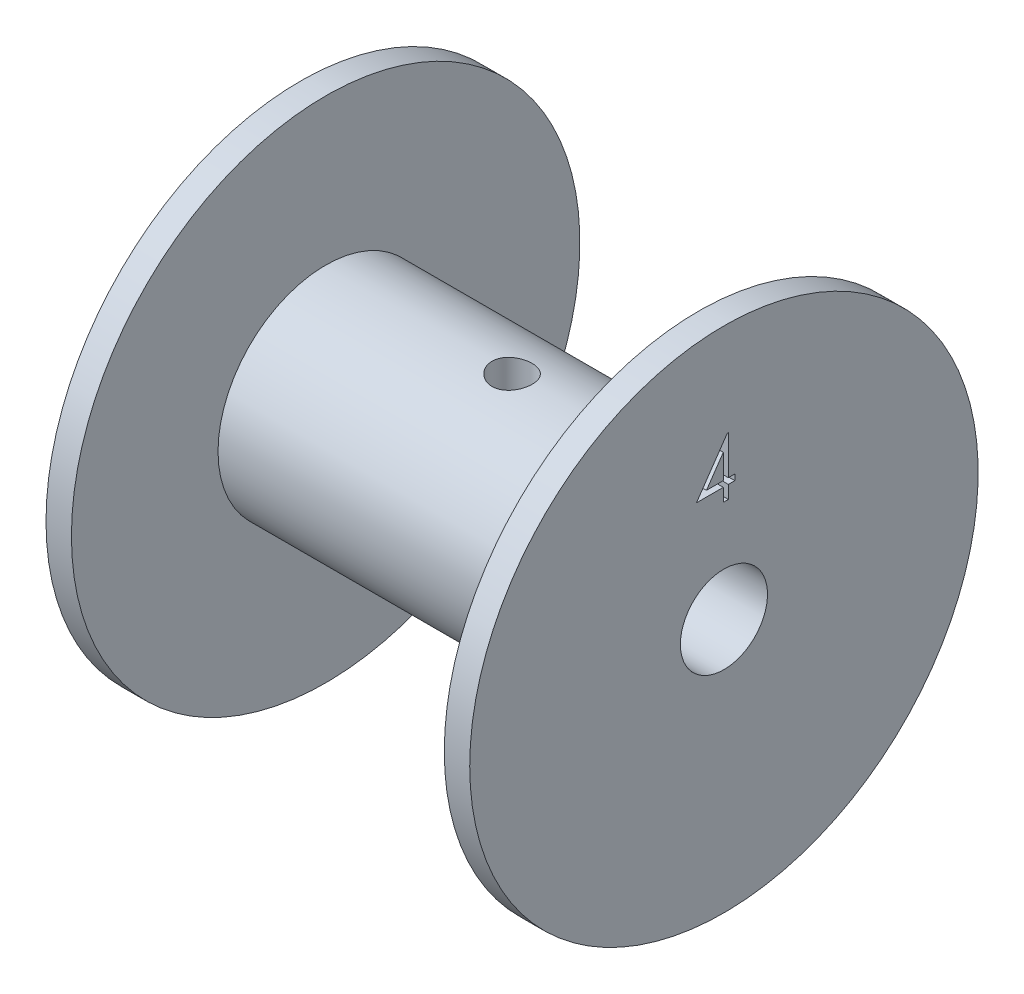
ISO-10303-21;
HEADER;
FILE_DESCRIPTION(('STEP AP214'),'2;1');
FILE_NAME('part.step','',(''),(''),'','','');
FILE_SCHEMA(('AUTOMOTIVE_DESIGN { 1 0 10303 214 1 1 1 1 }'));
ENDSEC;
DATA;
#1=APPLICATION_CONTEXT('core data for automotive mechanical design processes');
#2=APPLICATION_PROTOCOL_DEFINITION('international standard','automotive_design',2000,#1);
#3=PRODUCT_CONTEXT('',#1,'mechanical');
#4=PRODUCT('Part','Part','',(#3));
#5=PRODUCT_RELATED_PRODUCT_CATEGORY('part','',(#4));
#6=PRODUCT_DEFINITION_FORMATION('','',#4);
#7=PRODUCT_DEFINITION_CONTEXT('part definition',#1,'design');
#8=PRODUCT_DEFINITION('design','',#6,#7);
#9=PRODUCT_DEFINITION_SHAPE('','',#8);
#10=(LENGTH_UNIT() NAMED_UNIT(*) SI_UNIT(.MILLI.,.METRE.));
#11=(NAMED_UNIT(*) PLANE_ANGLE_UNIT() SI_UNIT($,.RADIAN.));
#12=(NAMED_UNIT(*) SI_UNIT($,.STERADIAN.) SOLID_ANGLE_UNIT());
#13=UNCERTAINTY_MEASURE_WITH_UNIT(LENGTH_MEASURE(1.E-05),#10,'distance_accuracy_value','');
#14=(GEOMETRIC_REPRESENTATION_CONTEXT(3) GLOBAL_UNCERTAINTY_ASSIGNED_CONTEXT((#13)) GLOBAL_UNIT_ASSIGNED_CONTEXT((#10,
#11,#12)) REPRESENTATION_CONTEXT('',''));
#15=CARTESIAN_POINT('',(0.,0.,0.));
#16=DIRECTION('',(0.,0.,1.));
#17=DIRECTION('',(1.,0.,0.));
#18=AXIS2_PLACEMENT_3D('',#15,#16,#17);
#19=CARTESIAN_POINT('',(15.875,0.,0.));
#20=DIRECTION('',(1.,0.,0.));
#21=DIRECTION('',(0.,0.,-1.));
#22=AXIS2_PLACEMENT_3D('',#19,#20,#21);
#23=PLANE('',#22);
#24=CARTESIAN_POINT('',(15.875,0.,0.));
#25=DIRECTION('',(-1.,0.,0.));
#26=DIRECTION('',(0.,0.,1.));
#27=AXIS2_PLACEMENT_3D('',#24,#25,#26);
#28=CIRCLE('',#27,19.05);
#29=CARTESIAN_POINT('',(15.875,0.,19.05));
#30=VERTEX_POINT('',#29);
#31=EDGE_CURVE('E544',#30,#30,#28,.T.);
#32=ORIENTED_EDGE('',*,*,#31,.F.);
#33=EDGE_LOOP('',(#32));
#34=FACE_BOUND('',#33,.T.);
#35=CARTESIAN_POINT('',(15.875,0.,0.));
#36=DIRECTION('',(-1.,0.,0.));
#37=DIRECTION('',(0.,0.,1.));
#38=AXIS2_PLACEMENT_3D('',#35,#36,#37);
#39=CIRCLE('',#38,3.2639);
#40=CARTESIAN_POINT('',(15.875,0.,3.2639));
#41=VERTEX_POINT('',#40);
#42=EDGE_CURVE('E538',#41,#41,#39,.T.);
#43=ORIENTED_EDGE('',*,*,#42,.T.);
#44=EDGE_LOOP('',(#43));
#45=FACE_BOUND('',#44,.T.);
#46=DIRECTION('',(0.,0.,1.));
#47=VECTOR('',#46,1.);
#48=CARTESIAN_POINT('',(15.875,8.59214968415188,0.0492425133830675));
#49=LINE('',#48,#47);
#50=CARTESIAN_POINT('',(15.875,8.59214968415188,0.0492425133830675));
#51=VERTEX_POINT('',#50);
#52=CARTESIAN_POINT('',(15.875,8.59214968415188,2.05736217150273));
#53=VERTEX_POINT('',#52);
#54=EDGE_CURVE('E205',#51,#53,#49,.T.);
#55=ORIENTED_EDGE('',*,*,#54,.T.);
#56=DIRECTION('',(0.,0.824332768950697,-0.566105543193208));
#57=VECTOR('',#56,1.);
#58=CARTESIAN_POINT('',(15.875,8.59214968415188,2.05736217150273));
#59=LINE('',#58,#57);
#60=CARTESIAN_POINT('',(15.875,11.9571069491091,-0.253501877642574));
#61=VERTEX_POINT('',#60);
#62=EDGE_CURVE('E77',#53,#61,#59,.T.);
#63=ORIENTED_EDGE('',*,*,#62,.T.);
#64=DIRECTION('',(0.,0.,-1.));
#65=VECTOR('',#64,1.);
#66=CARTESIAN_POINT('',(15.875,11.9571069491091,-0.253501877642574));
#67=LINE('',#66,#65);
#68=CARTESIAN_POINT('',(15.875,11.9571069491091,-0.330672016531463));
#69=VERTEX_POINT('',#68);
#70=EDGE_CURVE('E235',#61,#69,#67,.T.);
#71=ORIENTED_EDGE('',*,*,#70,.T.);
#72=DIRECTION('',(0.,-1.,0.));
#73=VECTOR('',#72,1.);
#74=CARTESIAN_POINT('',(15.875,11.9571069491091,-0.330672016531463));
#75=LINE('',#74,#73);
#76=CARTESIAN_POINT('',(15.875,9.02633771833992,-0.330672016531463));
#77=VERTEX_POINT('',#76);
#78=EDGE_CURVE('E239',#69,#77,#75,.T.);
#79=ORIENTED_EDGE('',*,*,#78,.T.);
#80=DIRECTION('',(0.,0.,-1.));
#81=VECTOR('',#80,1.);
#82=CARTESIAN_POINT('',(15.875,9.02633771833992,-0.330672016531463));
#83=LINE('',#82,#81);
#84=CARTESIAN_POINT('',(15.875,9.02633771833992,-0.819133554993001));
#85=VERTEX_POINT('',#84);
#86=EDGE_CURVE('E243',#77,#85,#83,.T.);
#87=ORIENTED_EDGE('',*,*,#86,.T.);
#88=DIRECTION('',(0.,-1.,0.));
#89=VECTOR('',#88,1.);
#90=CARTESIAN_POINT('',(15.875,9.02633771833992,-0.819133554993001));
#91=LINE('',#90,#89);
#92=CARTESIAN_POINT('',(15.875,8.59214968415188,-0.819133554993001));
#93=VERTEX_POINT('',#92);
#94=EDGE_CURVE('E247',#85,#93,#91,.T.);
#95=ORIENTED_EDGE('',*,*,#94,.T.);
#96=DIRECTION('',(0.,0.,1.));
#97=VECTOR('',#96,1.);
#98=CARTESIAN_POINT('',(15.875,8.59214968415188,-0.819133554993001));
#99=LINE('',#98,#97);
#100=CARTESIAN_POINT('',(15.875,8.59214968415188,-0.330672016531463));
#101=VERTEX_POINT('',#100);
#102=EDGE_CURVE('E251',#93,#101,#99,.T.);
#103=ORIENTED_EDGE('',*,*,#102,.T.);
#104=DIRECTION('',(0.,-1.,0.));
#105=VECTOR('',#104,1.);
#106=CARTESIAN_POINT('',(15.875,8.59214968415188,-0.330672016531463));
#107=LINE('',#106,#105);
#108=CARTESIAN_POINT('',(15.875,7.61522660722881,-0.330672016531463));
#109=VERTEX_POINT('',#108);
#110=EDGE_CURVE('E255',#101,#109,#107,.T.);
#111=ORIENTED_EDGE('',*,*,#110,.T.);
#112=DIRECTION('',(0.,0.,1.));
#113=VECTOR('',#112,1.);
#114=CARTESIAN_POINT('',(15.875,7.61522660722881,-0.330672016531463));
#115=LINE('',#114,#113);
#116=CARTESIAN_POINT('',(15.875,7.61522660722881,0.0492425133830675));
#117=VERTEX_POINT('',#116);
#118=EDGE_CURVE('E259',#109,#117,#115,.T.);
#119=ORIENTED_EDGE('',*,*,#118,.T.);
#120=DIRECTION('',(0.,1.,0.));
#121=VECTOR('',#120,1.);
#122=CARTESIAN_POINT('',(15.875,7.61522660722881,0.0492425133830675));
#123=LINE('',#122,#121);
#124=EDGE_CURVE('E263',#117,#51,#123,.T.);
#125=ORIENTED_EDGE('',*,*,#124,.T.);
#126=EDGE_LOOP('',(#55,#63,#71,#79,#87,#95,#103,#111,#119,#125));
#127=FACE_BOUND('',#126,.T.);
#128=ADVANCED_FACE('F55',(#34,#45,#127),#23,.T.);
#129=CARTESIAN_POINT('',(-15.2755244755245,0.,0.));
#130=DIRECTION('',(-1.,0.,0.));
#131=DIRECTION('',(0.,0.,1.));
#132=AXIS2_PLACEMENT_3D('',#129,#130,#131);
#133=CYLINDRICAL_SURFACE('',#132,3.2639);
#134=ORIENTED_EDGE('',*,*,#42,.F.);
#135=EDGE_LOOP('',(#134));
#136=FACE_BOUND('',#135,.T.);
#137=CARTESIAN_POINT('',(-15.875,0.,0.));
#138=DIRECTION('',(-1.,0.,0.));
#139=DIRECTION('',(0.,0.,1.));
#140=AXIS2_PLACEMENT_3D('',#137,#138,#139);
#141=CIRCLE('',#140,3.2639);
#142=CARTESIAN_POINT('',(-15.875,0.,3.2639));
#143=VERTEX_POINT('',#142);
#144=EDGE_CURVE('E534',#143,#143,#141,.T.);
#145=ORIENTED_EDGE('',*,*,#144,.T.);
#146=EDGE_LOOP('',(#145));
#147=FACE_BOUND('',#146,.T.);
#148=CARTESIAN_POINT('',(0.,2.89880030529873,-1.5));
#149=CARTESIAN_POINT('',(0.0790996516935138,2.89880527561324,-1.49999562888561));
#150=CARTESIAN_POINT('',(0.158320250034026,2.90208553286035,-1.49370282771376));
#151=CARTESIAN_POINT('',(0.314404144655895,2.91475562220929,-1.46881835615961));
#152=CARTESIAN_POINT('',(0.39126124844822,2.92416027333155,-1.45019685254192));
#153=CARTESIAN_POINT('',(0.540075222183161,2.94776959758479,-1.40157672093983));
#154=CARTESIAN_POINT('',(0.612053190725333,2.96195177720418,-1.37163132846496));
#155=CARTESIAN_POINT('',(0.749945957676851,2.99348393610173,-1.30137415579378));
#156=CARTESIAN_POINT('',(0.815861289866018,3.01083363609592,-1.26106328940553));
#157=CARTESIAN_POINT('',(0.944807246158478,3.04821819116792,-1.16794358073086));
#158=CARTESIAN_POINT('',(1.00732358044601,3.06835575428552,-1.11446347610267));
#159=CARTESIAN_POINT('',(1.12288984055446,3.10821141978066,-0.997926351466339));
#160=CARTESIAN_POINT('',(1.17593562547437,3.12792933536892,-0.934865164425018));
#161=CARTESIAN_POINT('',(1.27388568949512,3.16601944216034,-0.79672235392753));
#162=CARTESIAN_POINT('',(1.31818452545821,3.18425867648961,-0.72117138948212));
#163=CARTESIAN_POINT('',(1.39321424300287,3.21604257638909,-0.562696489355767));
#164=CARTESIAN_POINT('',(1.42395239087329,3.2295897552875,-0.479776530927243));
#165=CARTESIAN_POINT('',(1.46903999716533,3.24972935143184,-0.314342388648941));
#166=CARTESIAN_POINT('',(1.48428365824427,3.25669932048255,-0.232118864742521));
#167=CARTESIAN_POINT('',(1.50086644941666,3.26428940896041,-0.0660066846725445));
#168=CARTESIAN_POINT('',(1.50221254311911,3.26491270849051,0.0178811164623854));
#169=CARTESIAN_POINT('',(1.49137016039524,3.25994049007858,0.178331426255546));
#170=CARTESIAN_POINT('',(1.480172524589,3.25480021404519,0.254977908949155));
#171=CARTESIAN_POINT('',(1.4462956937537,3.23953493849258,0.405161294026317));
#172=CARTESIAN_POINT('',(1.42361564684385,3.22940956913052,0.478697965254099));
#173=CARTESIAN_POINT('',(1.36719386401737,3.20493503494148,0.621930808098315));
#174=CARTESIAN_POINT('',(1.33329076401563,3.19052458682296,0.691552510683825));
#175=CARTESIAN_POINT('',(1.25556849463177,3.15883483774738,0.824299640076356));
#176=CARTESIAN_POINT('',(1.21174568934024,3.14155448549286,0.887422672526702));
#177=CARTESIAN_POINT('',(1.11122339397753,3.10411156902047,1.01095949291504));
#178=CARTESIAN_POINT('',(1.05375706512932,3.08382882563193,1.07071363137975));
#179=CARTESIAN_POINT('',(0.929679881022665,3.04366617374249,1.1800590994381));
#180=CARTESIAN_POINT('',(0.863063885723971,3.02378649893019,1.22964467729055));
#181=CARTESIAN_POINT('',(0.718686671715955,2.98571416965451,1.31948851163111));
#182=CARTESIAN_POINT('',(0.640548557252857,2.96764488331522,1.35919820448272));
#183=CARTESIAN_POINT('',(0.477653333865979,2.93680668030353,1.42461654475169));
#184=CARTESIAN_POINT('',(0.392902192560393,2.92403304906243,1.45033765219265));
#185=CARTESIAN_POINT('',(0.225802845006685,2.90648388606788,1.48517706240256));
#186=CARTESIAN_POINT('',(0.143736220736677,2.90118928688017,1.49537716667244));
#187=CARTESIAN_POINT('',(-0.0210893502118351,2.89770846023625,1.50211474376186));
#188=CARTESIAN_POINT('',(-0.103847935428561,2.89951872779674,1.4986589533217));
#189=CARTESIAN_POINT('',(-0.26023569160373,2.90949889075176,1.47917422053609));
#190=CARTESIAN_POINT('',(-0.334041966968236,2.9171138401751,1.46424152712169));
#191=CARTESIAN_POINT('',(-0.478003968484861,2.9370805060175,1.42376494799707));
#192=CARTESIAN_POINT('',(-0.548158699492478,2.94943350608651,1.39821818652863));
#193=CARTESIAN_POINT('',(-0.686432501917021,2.97816114778239,1.3359720540446));
#194=CARTESIAN_POINT('',(-0.754312351166241,2.99469366799963,1.29881670222953));
#195=CARTESIAN_POINT('',(-0.883239346300772,3.0297356323434,1.21483093488013));
#196=CARTESIAN_POINT('',(-0.944283140852463,3.04824603750166,1.16799580563247));
#197=CARTESIAN_POINT('',(-1.06436450383752,3.08745332815401,1.06032114530804));
#198=CARTESIAN_POINT('',(-1.12254866408067,3.10817913865338,0.998536287917744));
#199=CARTESIAN_POINT('',(-1.22793362487446,3.14777321336532,0.86566139719664));
#200=CARTESIAN_POINT('',(-1.27513237631578,3.16664113064683,0.794569631705327));
#201=CARTESIAN_POINT('',(-1.357610303357,3.20073718141275,0.643716498679115));
#202=CARTESIAN_POINT('',(-1.39273209640622,3.21591655150368,0.563857336766688));
#203=CARTESIAN_POINT('',(-1.44873255580706,3.24056036874709,0.398472466413037));
#204=CARTESIAN_POINT('',(-1.46962173041189,3.25002903164516,0.312950989881227));
#205=CARTESIAN_POINT('',(-1.49504091876315,3.26160639918985,0.14620715160293));
#206=CARTESIAN_POINT('',(-1.50076704319665,3.26425276121958,0.0652036520203347));
#207=CARTESIAN_POINT('',(-1.49906839970213,3.26347161449856,-0.0966252657406345));
#208=CARTESIAN_POINT('',(-1.49164693181325,3.26004562990368,-0.177450723509184));
#209=CARTESIAN_POINT('',(-1.46470749668887,3.24781142853747,-0.332435456965067));
#210=CARTESIAN_POINT('',(-1.44580957982146,3.23927940424884,-0.406726339909351));
#211=CARTESIAN_POINT('',(-1.39720664118427,3.21788050344879,-0.551009932867221));
#212=CARTESIAN_POINT('',(-1.36749981782543,3.20501290432604,-0.621001924082847));
#213=CARTESIAN_POINT('',(-1.29664807263731,3.17541457734275,-0.758247166207723));
#214=CARTESIAN_POINT('',(-1.25504325911162,3.15853442081142,-0.825229902560969));
#215=CARTESIAN_POINT('',(-1.1621920238739,3.12280295711357,-0.951557533159323));
#216=CARTESIAN_POINT('',(-1.11094133240999,3.10395077867864,-1.01089902533823));
#217=CARTESIAN_POINT('',(-0.99518338261877,3.06434840291816,-1.12551907160221));
#218=CARTESIAN_POINT('',(-0.929921391286239,3.04357257163549,-1.18002907121177));
#219=CARTESIAN_POINT('',(-0.790671903767917,3.00395701816432,-1.27752229379591));
#220=CARTESIAN_POINT('',(-0.716678535725907,2.98511861501599,-1.32049769541072));
#221=CARTESIAN_POINT('',(-0.560846635721029,2.95156757814252,-1.39389546088483));
#222=CARTESIAN_POINT('',(-0.478936054111541,2.93689879318421,-1.42418589038585));
#223=CARTESIAN_POINT('',(-0.310380624510013,2.9141859980432,-1.47011531473031));
#224=CARTESIAN_POINT('',(-0.223752717951128,2.90611975897312,-1.48580349584591));
#225=CARTESIAN_POINT('',(-0.113735198988045,2.90094066019103,-1.49585650081376));
#226=CARTESIAN_POINT('',(-0.091026659803017,2.90013998056624,-1.49740859021873));
#227=CARTESIAN_POINT('',(-0.0455487588909494,2.89906907683888,-1.49948098982813));
#228=CARTESIAN_POINT('',(-0.0227793947701969,2.89879887393015,-1.50000125880883));
#229=CARTESIAN_POINT('',(0.,2.89880030529873,-1.5));
#230=B_SPLINE_CURVE_WITH_KNOTS('',3,(#148,#149,#150,#151,#152,#153,#154,#155,#156,#157,#158,
#159,#160,#161,#162,#163,#164,#165,#166,#167,#168,#169,#170,#171,#172,#173,#174,#175,#176,#177,
#178,#179,#180,#181,#182,#183,#184,#185,#186,#187,#188,#189,#190,#191,#192,#193,#194,#195,#196,
#197,#198,#199,#200,#201,#202,#203,#204,#205,#206,#207,#208,#209,#210,#211,#212,#213,#214,#215,
#216,#217,#218,#219,#220,#221,#222,#223,#224,#225,#226,#227,#228,#229),.UNSPECIFIED.,.T.,.F.,(4,
2,2,2,2,2,2,2,2,2,2,2,2,2,2,2,2,2,2,2,2,2,2,2,2,2,2,2,2,2,2,2,2,2,2,2,2,2,2,2,4),(0.,
0.237203189696035,0.474982476525481,0.711657546425639,0.948311758477205,1.20132318199304,
1.45444496267726,1.72143763565181,1.98828707037603,2.23867110545604,2.4889296753275,
2.7207319090989,2.95255134281318,3.18786016720205,3.42325538034084,3.67818710396844,
3.93326263175079,4.20033846871914,4.46717602253172,4.7143917084905,4.96148545297666,
5.18752811202665,5.41363205468389,5.65006024805299,5.88660384611185,6.14749769561396,
6.40844017073846,6.67266460105803,6.93669373669233,7.17917208043359,7.42158957085376,
7.65194904007446,7.88234692237207,8.12325320723308,8.3642663812359,8.62567120686442,
8.88725284015569,9.15149135052853,9.41483654317816,9.48314441962767,9.55145502508737),.UNSPECIFIED.);
#231=CARTESIAN_POINT('',(0.,2.89880030529873,-1.5));
#232=VERTEX_POINT('',#231);
#233=EDGE_CURVE('E299',#232,#232,#230,.T.);
#234=ORIENTED_EDGE('',*,*,#233,.F.);
#235=EDGE_LOOP('',(#234));
#236=FACE_BOUND('',#235,.T.);
#237=ADVANCED_FACE('F309',(#136,#147,#236),#133,.F.);
#238=CARTESIAN_POINT('',(-15.2755244755245,0.,0.));
#239=DIRECTION('',(-1.,0.,0.));
#240=DIRECTION('',(0.,0.,1.));
#241=AXIS2_PLACEMENT_3D('',#238,#239,#240);
#242=CYLINDRICAL_SURFACE('',#241,8.0645);
#243=CARTESIAN_POINT('',(-13.97,0.,0.));
#244=DIRECTION('',(-1.,0.,0.));
#245=DIRECTION('',(0.,0.,1.));
#246=AXIS2_PLACEMENT_3D('',#243,#244,#245);
#247=CIRCLE('',#246,8.0645);
#248=CARTESIAN_POINT('',(-13.97,0.,8.0645));
#249=VERTEX_POINT('',#248);
#250=EDGE_CURVE('E307',#249,#249,#247,.T.);
#251=ORIENTED_EDGE('',*,*,#250,.F.);
#252=EDGE_LOOP('',(#251));
#253=FACE_BOUND('',#252,.T.);
#254=CARTESIAN_POINT('',(13.97,0.,0.));
#255=DIRECTION('',(-1.,0.,0.));
#256=DIRECTION('',(0.,0.,1.));
#257=AXIS2_PLACEMENT_3D('',#254,#255,#256);
#258=CIRCLE('',#257,8.0645);
#259=CARTESIAN_POINT('',(13.97,0.,8.0645));
#260=VERTEX_POINT('',#259);
#261=EDGE_CURVE('E551',#260,#260,#258,.T.);
#262=ORIENTED_EDGE('',*,*,#261,.T.);
#263=EDGE_LOOP('',(#262));
#264=FACE_BOUND('',#263,.T.);
#265=CARTESIAN_POINT('',(0.,7.92377184489811,-1.5));
#266=CARTESIAN_POINT('',(0.0834699922512401,7.9237734538727,-1.49999678574282));
#267=CARTESIAN_POINT('',(0.166981831122598,7.92510509008183,-1.49300912525413));
#268=CARTESIAN_POINT('',(0.331651557475362,7.93028125737973,-1.465261443805));
#269=CARTESIAN_POINT('',(0.412807373113566,7.93412793417546,-1.44448966269515));
#270=CARTESIAN_POINT('',(0.570358559424111,7.94388378807498,-1.38983296497414));
#271=CARTESIAN_POINT('',(0.646758254354493,7.94979105843547,-1.35596016807497));
#272=CARTESIAN_POINT('',(0.792785415471453,7.96300024226805,-1.27609492678907));
#273=CARTESIAN_POINT('',(0.862413427047706,7.97030204328437,-1.23010345954554));
#274=CARTESIAN_POINT('',(0.993779031686728,7.9855774618328,-1.12670590430802));
#275=CARTESIAN_POINT('',(1.05542163619568,7.99355757328761,-1.06918007561075));
#276=CARTESIAN_POINT('',(1.16823920190923,8.00923307476703,-0.944605532926529));
#277=CARTESIAN_POINT('',(1.21941348113181,8.0169284462149,-0.877556198991763));
#278=CARTESIAN_POINT('',(1.31020518495352,8.03123691251547,-0.735214641520338));
#279=CARTESIAN_POINT('',(1.34973313564861,8.03784146530635,-0.659864415440111));
#280=CARTESIAN_POINT('',(1.4155337793492,8.04915148284183,-0.50344933805365));
#281=CARTESIAN_POINT('',(1.44180754476066,8.05385710122446,-0.422384949689611));
#282=CARTESIAN_POINT('',(1.48006051144278,8.06079318837119,-0.2578267876196));
#283=CARTESIAN_POINT('',(1.49219980479087,8.06305135714503,-0.17437141552242));
#284=CARTESIAN_POINT('',(1.50233798434993,8.06493356258085,-0.00658004096476406));
#285=CARTESIAN_POINT('',(1.50033805628244,8.06455782012384,0.0777558870596313));
#286=CARTESIAN_POINT('',(1.48237749981114,8.06123620703969,0.243816740076963));
#287=CARTESIAN_POINT('',(1.46658924418254,8.05832207093516,0.325561034707383));
#288=CARTESIAN_POINT('',(1.42177273443912,8.0502866809281,0.485219503116541));
#289=CARTESIAN_POINT('',(1.39274400350547,8.04516534753988,0.563133538847228));
#290=CARTESIAN_POINT('',(1.32210579017994,8.03323788244329,0.713420735826199));
#291=CARTESIAN_POINT('',(1.28042724204538,8.02642253969638,0.785760673814137));
#292=CARTESIAN_POINT('',(1.18572336277713,8.01186102833994,0.922484388999932));
#293=CARTESIAN_POINT('',(1.13269689542425,8.0041147665555,0.986867368482127));
#294=CARTESIAN_POINT('',(1.01585206439317,7.98841171039542,1.10687065677505));
#295=CARTESIAN_POINT('',(0.951882907557722,7.98045350301508,1.16234405539621));
#296=CARTESIAN_POINT('',(0.815471301144276,7.9653353424318,1.26179684417697));
#297=CARTESIAN_POINT('',(0.743028731474736,7.95817540054528,1.305776071404));
#298=CARTESIAN_POINT('',(0.591533745322313,7.94546248569133,1.38103300471357));
#299=CARTESIAN_POINT('',(0.512470622228837,7.93991218309828,1.41228963841603));
#300=CARTESIAN_POINT('',(0.350088670254136,7.93108808617898,1.4610344761526));
#301=CARTESIAN_POINT('',(0.266770316402928,7.92781403833817,1.47852421348346));
#302=CARTESIAN_POINT('',(0.0995669829767135,7.92396322573631,1.49902487149708));
#303=CARTESIAN_POINT('',(0.0157087450574842,7.92334716793076,1.50224673307501));
#304=CARTESIAN_POINT('',(-0.151347559590066,7.92477697685847,1.49468538361545));
#305=CARTESIAN_POINT('',(-0.234545658220193,7.92682271416013,1.483902853551));
#306=CARTESIAN_POINT('',(-0.397228289082271,7.93330903129933,1.44881979239892));
#307=CARTESIAN_POINT('',(-0.47673746609808,7.93773005454083,1.42462960075962));
#308=CARTESIAN_POINT('',(-0.630574117098847,7.94845198992675,1.36353485958083));
#309=CARTESIAN_POINT('',(-0.704901214021849,7.95475303869108,1.326629386002));
#310=CARTESIAN_POINT('',(-0.847193844268481,7.96861467250661,1.24066526318392));
#311=CARTESIAN_POINT('',(-0.91507744549458,7.97618876284377,1.19147321412237));
#312=CARTESIAN_POINT('',(-1.04170287148394,7.99170496834265,1.08251244794541));
#313=CARTESIAN_POINT('',(-1.10044388710728,7.99964711599767,1.02274279568696));
#314=CARTESIAN_POINT('',(-1.20790342225976,8.0151306730024,0.893381906591112));
#315=CARTESIAN_POINT('',(-1.25648016441083,8.02266544854635,0.823671977041039));
#316=CARTESIAN_POINT('',(-1.34123220332478,8.03637407902485,0.676958042179703));
#317=CARTESIAN_POINT('',(-1.37740797217621,8.04254798576267,0.599954314676089));
#318=CARTESIAN_POINT('',(-1.43611829159826,8.05281069508312,0.441232587109994));
#319=CARTESIAN_POINT('',(-1.45872281202498,8.05691017535419,0.359541189147433));
#320=CARTESIAN_POINT('',(-1.4898724387586,8.06260765100307,0.193438057656403));
#321=CARTESIAN_POINT('',(-1.49841899979037,8.06420590520821,0.109026606522251));
#322=CARTESIAN_POINT('',(-1.50116011764579,8.06471581480838,-0.0587601988743191));
#323=CARTESIAN_POINT('',(-1.49556892499499,8.06366757682714,-0.142132006832127));
#324=CARTESIAN_POINT('',(-1.4706620512167,8.05908551327764,-0.306726317994639));
#325=CARTESIAN_POINT('',(-1.4513464971752,8.0555517107254,-0.387948841094244));
#326=CARTESIAN_POINT('',(-1.39962888793001,8.04639542707254,-0.545828097106257));
#327=CARTESIAN_POINT('',(-1.36724929448123,8.04077653231502,-0.622492408935781));
#328=CARTESIAN_POINT('',(-1.29034827815016,8.02805870428464,-0.769331984483264));
#329=CARTESIAN_POINT('',(-1.24582605920632,8.02095967398239,-0.839506822352059));
#330=CARTESIAN_POINT('',(-1.14516445600538,8.00593885136061,-0.972443982416024));
#331=CARTESIAN_POINT('',(-1.08887011890436,7.99800686931814,-1.03508783461836));
#332=CARTESIAN_POINT('',(-0.966584123846523,7.98227889621537,-1.15011418262556));
#333=CARTESIAN_POINT('',(-0.900590189522322,7.97448293755975,-1.20249426290747));
#334=CARTESIAN_POINT('',(-0.760061658823829,7.9598323995185,-1.29595246341368));
#335=CARTESIAN_POINT('',(-0.68545494399561,7.95298701211059,-1.33692362626079));
#336=CARTESIAN_POINT('',(-0.530314527576079,7.94112310521889,-1.40568546223609));
#337=CARTESIAN_POINT('',(-0.449786529692779,7.93610285467356,-1.43348863224149));
#338=CARTESIAN_POINT('',(-0.307512315550241,7.92950950462025,-1.46944509356762));
#339=CARTESIAN_POINT('',(-0.246601375268743,7.92737059720409,-1.480883642522));
#340=CARTESIAN_POINT('',(-0.123801280193672,7.92450118925832,-1.49616218729631));
#341=CARTESIAN_POINT('',(-0.0619121513189707,7.92377065147428,-1.50000238410921));
#342=CARTESIAN_POINT('',(0.,7.92377184489811,-1.5));
#343=B_SPLINE_CURVE_WITH_KNOTS('',3,(#265,#266,#267,#268,#269,#270,#271,#272,#273,#274,#275,
#276,#277,#278,#279,#280,#281,#282,#283,#284,#285,#286,#287,#288,#289,#290,#291,#292,#293,#294,
#295,#296,#297,#298,#299,#300,#301,#302,#303,#304,#305,#306,#307,#308,#309,#310,#311,#312,#313,
#314,#315,#316,#317,#318,#319,#320,#321,#322,#323,#324,#325,#326,#327,#328,#329,#330,#331,#332,
#333,#334,#335,#336,#337,#338,#339,#340,#341,#342),.UNSPECIFIED.,.T.,.F.,(4,2,2,2,2,2,2,2,2,2,2,
2,2,2,2,2,2,2,2,2,2,2,2,2,2,2,2,2,2,2,2,2,2,2,2,2,2,2,4),(0.,0.250183421207042,
0.500580565413789,0.750746619866986,1.00089250929468,1.25378386865681,1.50669169793819,
1.76149467250217,2.01627702746063,2.2681446572832,2.51999116562211,2.76873360564692,
3.01748500414491,3.26761974750813,3.51777954753311,3.77171474877918,4.02565354942093,
4.28001125295198,4.53434062322397,4.78489707662494,5.03544134700442,5.28395371670109,
5.53248414998902,5.78384013794753,6.03521835885676,6.28989837637596,6.54456869748887,
6.79791446964376,7.05123402379814,7.30073772756839,7.55023912099375,7.79931334807523,
8.0484039082057,8.30100669993306,8.55366886914115,8.808625562021,9.06333980498248,
9.24891312490274,9.43448153593896),.UNSPECIFIED.);
#344=CARTESIAN_POINT('',(0.,7.92377184489811,-1.5));
#345=VERTEX_POINT('',#344);
#346=EDGE_CURVE('E59',#345,#345,#343,.T.);
#347=ORIENTED_EDGE('',*,*,#346,.T.);
#348=EDGE_LOOP('',(#347));
#349=FACE_BOUND('',#348,.T.);
#350=ADVANCED_FACE('F321',(#253,#264,#349),#242,.T.);
#351=CARTESIAN_POINT('',(-13.97,0.,0.));
#352=DIRECTION('',(1.,0.,0.));
#353=DIRECTION('',(0.,0.,-1.));
#354=AXIS2_PLACEMENT_3D('',#351,#352,#353);
#355=PLANE('',#354);
#356=ORIENTED_EDGE('',*,*,#250,.T.);
#357=EDGE_LOOP('',(#356));
#358=FACE_BOUND('',#357,.T.);
#359=CARTESIAN_POINT('',(-13.97,0.,0.));
#360=DIRECTION('',(-1.,0.,0.));
#361=DIRECTION('',(0.,0.,1.));
#362=AXIS2_PLACEMENT_3D('',#359,#360,#361);
#363=CIRCLE('',#362,19.05);
#364=CARTESIAN_POINT('',(-13.97,0.,19.05));
#365=VERTEX_POINT('',#364);
#366=EDGE_CURVE('E11',#365,#365,#363,.T.);
#367=ORIENTED_EDGE('',*,*,#366,.F.);
#368=EDGE_LOOP('',(#367));
#369=FACE_BOUND('',#368,.T.);
#370=ADVANCED_FACE('F57',(#358,#369),#355,.T.);
#371=CARTESIAN_POINT('',(-15.2755244755245,0.,0.));
#372=DIRECTION('',(-1.,0.,0.));
#373=DIRECTION('',(0.,0.,1.));
#374=AXIS2_PLACEMENT_3D('',#371,#372,#373);
#375=CYLINDRICAL_SURFACE('',#374,19.05);
#376=ORIENTED_EDGE('',*,*,#366,.T.);
#377=EDGE_LOOP('',(#376));
#378=FACE_BOUND('',#377,.T.);
#379=CARTESIAN_POINT('',(-15.875,0.,0.));
#380=DIRECTION('',(-1.,0.,0.));
#381=DIRECTION('',(0.,0.,1.));
#382=AXIS2_PLACEMENT_3D('',#379,#380,#381);
#383=CIRCLE('',#382,19.05);
#384=CARTESIAN_POINT('',(-15.875,0.,19.05));
#385=VERTEX_POINT('',#384);
#386=EDGE_CURVE('E70',#385,#385,#383,.T.);
#387=ORIENTED_EDGE('',*,*,#386,.F.);
#388=EDGE_LOOP('',(#387));
#389=FACE_BOUND('',#388,.T.);
#390=ADVANCED_FACE('F479',(#378,#389),#375,.T.);
#391=CARTESIAN_POINT('',(-15.875,0.,0.));
#392=DIRECTION('',(1.,0.,0.));
#393=DIRECTION('',(0.,0.,-1.));
#394=AXIS2_PLACEMENT_3D('',#391,#392,#393);
#395=PLANE('',#394);
#396=ORIENTED_EDGE('',*,*,#144,.F.);
#397=EDGE_LOOP('',(#396));
#398=FACE_BOUND('',#397,.T.);
#399=ORIENTED_EDGE('',*,*,#386,.T.);
#400=EDGE_LOOP('',(#399));
#401=FACE_BOUND('',#400,.T.);
#402=ADVANCED_FACE('F332',(#398,#401),#395,.F.);
#403=CARTESIAN_POINT('',(-15.2755244755245,0.,0.));
#404=DIRECTION('',(-1.,0.,0.));
#405=DIRECTION('',(0.,0.,1.));
#406=AXIS2_PLACEMENT_3D('',#403,#404,#405);
#407=CYLINDRICAL_SURFACE('',#406,19.05);
#408=CARTESIAN_POINT('',(13.97,0.,0.));
#409=DIRECTION('',(-1.,0.,0.));
#410=DIRECTION('',(0.,0.,1.));
#411=AXIS2_PLACEMENT_3D('',#408,#409,#410);
#412=CIRCLE('',#411,19.05);
#413=CARTESIAN_POINT('',(13.97,0.,19.05));
#414=VERTEX_POINT('',#413);
#415=EDGE_CURVE('E548',#414,#414,#412,.T.);
#416=ORIENTED_EDGE('',*,*,#415,.F.);
#417=EDGE_LOOP('',(#416));
#418=FACE_BOUND('',#417,.T.);
#419=ORIENTED_EDGE('',*,*,#31,.T.);
#420=EDGE_LOOP('',(#419));
#421=FACE_BOUND('',#420,.T.);
#422=ADVANCED_FACE('F329',(#418,#421),#407,.T.);
#423=CARTESIAN_POINT('',(13.97,0.,0.));
#424=DIRECTION('',(1.,0.,0.));
#425=DIRECTION('',(0.,0.,-1.));
#426=AXIS2_PLACEMENT_3D('',#423,#424,#425);
#427=PLANE('',#426);
#428=ORIENTED_EDGE('',*,*,#261,.F.);
#429=EDGE_LOOP('',(#428));
#430=FACE_BOUND('',#429,.T.);
#431=ORIENTED_EDGE('',*,*,#415,.T.);
#432=EDGE_LOOP('',(#431));
#433=FACE_BOUND('',#432,.T.);
#434=ADVANCED_FACE('F318',(#430,#433),#427,.F.);
#435=CARTESIAN_POINT('',(0.,19.05,0.));
#436=DIRECTION('',(0.,-1.,0.));
#437=DIRECTION('',(0.,0.,-1.));
#438=AXIS2_PLACEMENT_3D('',#435,#436,#437);
#439=CYLINDRICAL_SURFACE('',#438,1.5);
#440=ORIENTED_EDGE('',*,*,#346,.F.);
#441=EDGE_LOOP('',(#440));
#442=FACE_BOUND('',#441,.T.);
#443=ORIENTED_EDGE('',*,*,#233,.T.);
#444=EDGE_LOOP('',(#443));
#445=FACE_BOUND('',#444,.T.);
#446=ADVANCED_FACE('F313',(#442,#445),#439,.F.);
#447=CARTESIAN_POINT('',(14.605,8.59214968415188,2.05736217150273));
#448=DIRECTION('',(0.,-0.566105543193208,-0.824332768950697));
#449=DIRECTION('',(0.,0.824332768950697,-0.566105543193208));
#450=AXIS2_PLACEMENT_3D('',#447,#448,#449);
#451=PLANE('',#450);
#452=ORIENTED_EDGE('',*,*,#62,.F.);
#453=DIRECTION('',(1.,0.,0.));
#454=VECTOR('',#453,1.);
#455=CARTESIAN_POINT('',(14.605,8.59214968415188,2.05736217150273));
#456=LINE('',#455,#454);
#457=CARTESIAN_POINT('',(14.605,8.59214968415188,2.05736217150273));
#458=VERTEX_POINT('',#457);
#459=EDGE_CURVE('E232',#458,#53,#456,.T.);
#460=ORIENTED_EDGE('',*,*,#459,.F.);
#461=DIRECTION('',(0.,0.824332768950697,-0.566105543193208));
#462=VECTOR('',#461,1.);
#463=CARTESIAN_POINT('',(14.605,8.59214968415188,2.05736217150273));
#464=LINE('',#463,#462);
#465=CARTESIAN_POINT('',(14.605,11.9571069491091,-0.253501877642574));
#466=VERTEX_POINT('',#465);
#467=EDGE_CURVE('E200',#458,#466,#464,.T.);
#468=ORIENTED_EDGE('',*,*,#467,.T.);
#469=DIRECTION('',(1.,0.,0.));
#470=VECTOR('',#469,1.);
#471=CARTESIAN_POINT('',(14.605,11.9571069491091,-0.253501877642574));
#472=LINE('',#471,#470);
#473=EDGE_CURVE('E296',#466,#61,#472,.T.);
#474=ORIENTED_EDGE('',*,*,#473,.T.);
#475=EDGE_LOOP('',(#452,#460,#468,#474));
#476=FACE_BOUND('',#475,.T.);
#477=ADVANCED_FACE('F317',(#476),#451,.T.);
#478=CARTESIAN_POINT('',(14.605,11.9571069491091,-0.253501877642574));
#479=DIRECTION('',(0.,-1.,0.));
#480=DIRECTION('',(0.,0.,-1.));
#481=AXIS2_PLACEMENT_3D('',#478,#479,#480);
#482=PLANE('',#481);
#483=ORIENTED_EDGE('',*,*,#70,.F.);
#484=ORIENTED_EDGE('',*,*,#473,.F.);
#485=DIRECTION('',(0.,0.,-1.));
#486=VECTOR('',#485,1.);
#487=CARTESIAN_POINT('',(14.605,11.9571069491091,-0.253501877642574));
#488=LINE('',#487,#486);
#489=CARTESIAN_POINT('',(14.605,11.9571069491091,-0.330672016531463));
#490=VERTEX_POINT('',#489);
#491=EDGE_CURVE('E204',#466,#490,#488,.T.);
#492=ORIENTED_EDGE('',*,*,#491,.T.);
#493=DIRECTION('',(1.,0.,0.));
#494=VECTOR('',#493,1.);
#495=CARTESIAN_POINT('',(14.605,11.9571069491091,-0.330672016531463));
#496=LINE('',#495,#494);
#497=EDGE_CURVE('E293',#490,#69,#496,.T.);
#498=ORIENTED_EDGE('',*,*,#497,.T.);
#499=EDGE_LOOP('',(#483,#484,#492,#498));
#500=FACE_BOUND('',#499,.T.);
#501=ADVANCED_FACE('F392',(#500),#482,.T.);
#502=CARTESIAN_POINT('',(14.605,11.9571069491091,-0.330672016531463));
#503=DIRECTION('',(0.,0.,1.));
#504=DIRECTION('',(1.,0.,0.));
#505=AXIS2_PLACEMENT_3D('',#502,#503,#504);
#506=PLANE('',#505);
#507=ORIENTED_EDGE('',*,*,#78,.F.);
#508=ORIENTED_EDGE('',*,*,#497,.F.);
#509=DIRECTION('',(0.,-1.,0.));
#510=VECTOR('',#509,1.);
#511=CARTESIAN_POINT('',(14.605,11.9571069491091,-0.330672016531463));
#512=LINE('',#511,#510);
#513=CARTESIAN_POINT('',(14.605,9.02633771833992,-0.330672016531463));
#514=VERTEX_POINT('',#513);
#515=EDGE_CURVE('E208',#490,#514,#512,.T.);
#516=ORIENTED_EDGE('',*,*,#515,.T.);
#517=DIRECTION('',(1.,0.,0.));
#518=VECTOR('',#517,1.);
#519=CARTESIAN_POINT('',(14.605,9.02633771833992,-0.330672016531463));
#520=LINE('',#519,#518);
#521=EDGE_CURVE('E290',#514,#77,#520,.T.);
#522=ORIENTED_EDGE('',*,*,#521,.T.);
#523=EDGE_LOOP('',(#507,#508,#516,#522));
#524=FACE_BOUND('',#523,.T.);
#525=ADVANCED_FACE('F389',(#524),#506,.T.);
#526=CARTESIAN_POINT('',(14.605,9.02633771833992,-0.330672016531463));
#527=DIRECTION('',(0.,-1.,0.));
#528=DIRECTION('',(0.,0.,-1.));
#529=AXIS2_PLACEMENT_3D('',#526,#527,#528);
#530=PLANE('',#529);
#531=ORIENTED_EDGE('',*,*,#86,.F.);
#532=ORIENTED_EDGE('',*,*,#521,.F.);
#533=DIRECTION('',(0.,0.,-1.));
#534=VECTOR('',#533,1.);
#535=CARTESIAN_POINT('',(14.605,9.02633771833992,-0.330672016531463));
#536=LINE('',#535,#534);
#537=CARTESIAN_POINT('',(14.605,9.02633771833992,-0.819133554993001));
#538=VERTEX_POINT('',#537);
#539=EDGE_CURVE('E211',#514,#538,#536,.T.);
#540=ORIENTED_EDGE('',*,*,#539,.T.);
#541=DIRECTION('',(1.,0.,0.));
#542=VECTOR('',#541,1.);
#543=CARTESIAN_POINT('',(14.605,9.02633771833992,-0.819133554993001));
#544=LINE('',#543,#542);
#545=EDGE_CURVE('E287',#538,#85,#544,.T.);
#546=ORIENTED_EDGE('',*,*,#545,.T.);
#547=EDGE_LOOP('',(#531,#532,#540,#546));
#548=FACE_BOUND('',#547,.T.);
#549=ADVANCED_FACE('F385',(#548),#530,.T.);
#550=CARTESIAN_POINT('',(14.605,9.02633771833992,-0.819133554993001));
#551=DIRECTION('',(0.,0.,1.));
#552=DIRECTION('',(1.,0.,0.));
#553=AXIS2_PLACEMENT_3D('',#550,#551,#552);
#554=PLANE('',#553);
#555=ORIENTED_EDGE('',*,*,#94,.F.);
#556=ORIENTED_EDGE('',*,*,#545,.F.);
#557=DIRECTION('',(0.,-1.,0.));
#558=VECTOR('',#557,1.);
#559=CARTESIAN_POINT('',(14.605,9.02633771833992,-0.819133554993001));
#560=LINE('',#559,#558);
#561=CARTESIAN_POINT('',(14.605,8.59214968415188,-0.819133554993001));
#562=VERTEX_POINT('',#561);
#563=EDGE_CURVE('E214',#538,#562,#560,.T.);
#564=ORIENTED_EDGE('',*,*,#563,.T.);
#565=DIRECTION('',(1.,0.,0.));
#566=VECTOR('',#565,1.);
#567=CARTESIAN_POINT('',(14.605,8.59214968415188,-0.819133554993001));
#568=LINE('',#567,#566);
#569=EDGE_CURVE('E284',#562,#93,#568,.T.);
#570=ORIENTED_EDGE('',*,*,#569,.T.);
#571=EDGE_LOOP('',(#555,#556,#564,#570));
#572=FACE_BOUND('',#571,.T.);
#573=ADVANCED_FACE('F381',(#572),#554,.T.);
#574=CARTESIAN_POINT('',(14.605,8.59214968415188,-0.819133554993001));
#575=DIRECTION('',(0.,1.,0.));
#576=DIRECTION('',(0.,0.,1.));
#577=AXIS2_PLACEMENT_3D('',#574,#575,#576);
#578=PLANE('',#577);
#579=ORIENTED_EDGE('',*,*,#102,.F.);
#580=ORIENTED_EDGE('',*,*,#569,.F.);
#581=DIRECTION('',(0.,0.,1.));
#582=VECTOR('',#581,1.);
#583=CARTESIAN_POINT('',(14.605,8.59214968415188,-0.819133554993001));
#584=LINE('',#583,#582);
#585=CARTESIAN_POINT('',(14.605,8.59214968415188,-0.330672016531463));
#586=VERTEX_POINT('',#585);
#587=EDGE_CURVE('E217',#562,#586,#584,.T.);
#588=ORIENTED_EDGE('',*,*,#587,.T.);
#589=DIRECTION('',(1.,0.,0.));
#590=VECTOR('',#589,1.);
#591=CARTESIAN_POINT('',(14.605,8.59214968415188,-0.330672016531463));
#592=LINE('',#591,#590);
#593=EDGE_CURVE('E281',#586,#101,#592,.T.);
#594=ORIENTED_EDGE('',*,*,#593,.T.);
#595=EDGE_LOOP('',(#579,#580,#588,#594));
#596=FACE_BOUND('',#595,.T.);
#597=ADVANCED_FACE('F377',(#596),#578,.T.);
#598=CARTESIAN_POINT('',(14.605,8.59214968415188,-0.330672016531463));
#599=DIRECTION('',(0.,0.,1.));
#600=DIRECTION('',(1.,0.,0.));
#601=AXIS2_PLACEMENT_3D('',#598,#599,#600);
#602=PLANE('',#601);
#603=ORIENTED_EDGE('',*,*,#110,.F.);
#604=ORIENTED_EDGE('',*,*,#593,.F.);
#605=DIRECTION('',(0.,-1.,0.));
#606=VECTOR('',#605,1.);
#607=CARTESIAN_POINT('',(14.605,8.59214968415188,-0.330672016531463));
#608=LINE('',#607,#606);
#609=CARTESIAN_POINT('',(14.605,7.61522660722881,-0.330672016531463));
#610=VERTEX_POINT('',#609);
#611=EDGE_CURVE('E220',#586,#610,#608,.T.);
#612=ORIENTED_EDGE('',*,*,#611,.T.);
#613=DIRECTION('',(1.,0.,0.));
#614=VECTOR('',#613,1.);
#615=CARTESIAN_POINT('',(14.605,7.61522660722881,-0.330672016531463));
#616=LINE('',#615,#614);
#617=EDGE_CURVE('E278',#610,#109,#616,.T.);
#618=ORIENTED_EDGE('',*,*,#617,.T.);
#619=EDGE_LOOP('',(#603,#604,#612,#618));
#620=FACE_BOUND('',#619,.T.);
#621=ADVANCED_FACE('F373',(#620),#602,.T.);
#622=CARTESIAN_POINT('',(14.605,7.61522660722881,-0.330672016531463));
#623=DIRECTION('',(0.,1.,0.));
#624=DIRECTION('',(0.,0.,1.));
#625=AXIS2_PLACEMENT_3D('',#622,#623,#624);
#626=PLANE('',#625);
#627=ORIENTED_EDGE('',*,*,#118,.F.);
#628=ORIENTED_EDGE('',*,*,#617,.F.);
#629=DIRECTION('',(0.,0.,1.));
#630=VECTOR('',#629,1.);
#631=CARTESIAN_POINT('',(14.605,7.61522660722881,-0.330672016531463));
#632=LINE('',#631,#630);
#633=CARTESIAN_POINT('',(14.605,7.61522660722881,0.0492425133830675));
#634=VERTEX_POINT('',#633);
#635=EDGE_CURVE('E223',#610,#634,#632,.T.);
#636=ORIENTED_EDGE('',*,*,#635,.T.);
#637=DIRECTION('',(1.,0.,0.));
#638=VECTOR('',#637,1.);
#639=CARTESIAN_POINT('',(14.605,7.61522660722881,0.0492425133830675));
#640=LINE('',#639,#638);
#641=EDGE_CURVE('E275',#634,#117,#640,.T.);
#642=ORIENTED_EDGE('',*,*,#641,.T.);
#643=EDGE_LOOP('',(#627,#628,#636,#642));
#644=FACE_BOUND('',#643,.T.);
#645=ADVANCED_FACE('F369',(#644),#626,.T.);
#646=CARTESIAN_POINT('',(14.605,7.61522660722881,0.0492425133830675));
#647=DIRECTION('',(0.,0.,-1.));
#648=DIRECTION('',(-1.,0.,0.));
#649=AXIS2_PLACEMENT_3D('',#646,#647,#648);
#650=PLANE('',#649);
#651=ORIENTED_EDGE('',*,*,#124,.F.);
#652=ORIENTED_EDGE('',*,*,#641,.F.);
#653=DIRECTION('',(0.,1.,0.));
#654=VECTOR('',#653,1.);
#655=CARTESIAN_POINT('',(14.605,7.61522660722881,0.0492425133830675));
#656=LINE('',#655,#654);
#657=CARTESIAN_POINT('',(14.605,8.59214968415188,0.0492425133830675));
#658=VERTEX_POINT('',#657);
#659=EDGE_CURVE('E226',#634,#658,#656,.T.);
#660=ORIENTED_EDGE('',*,*,#659,.T.);
#661=DIRECTION('',(1.,0.,0.));
#662=VECTOR('',#661,1.);
#663=CARTESIAN_POINT('',(14.605,8.59214968415188,0.0492425133830675));
#664=LINE('',#663,#662);
#665=EDGE_CURVE('E272',#658,#51,#664,.T.);
#666=ORIENTED_EDGE('',*,*,#665,.T.);
#667=EDGE_LOOP('',(#651,#652,#660,#666));
#668=FACE_BOUND('',#667,.T.);
#669=ADVANCED_FACE('F365',(#668),#650,.T.);
#670=CARTESIAN_POINT('',(14.605,8.59214968415188,0.0492425133830675));
#671=DIRECTION('',(0.,1.,0.));
#672=DIRECTION('',(0.,0.,1.));
#673=AXIS2_PLACEMENT_3D('',#670,#671,#672);
#674=PLANE('',#673);
#675=ORIENTED_EDGE('',*,*,#54,.F.);
#676=ORIENTED_EDGE('',*,*,#665,.F.);
#677=DIRECTION('',(0.,0.,1.));
#678=VECTOR('',#677,1.);
#679=CARTESIAN_POINT('',(14.605,8.59214968415188,0.0492425133830675));
#680=LINE('',#679,#678);
#681=EDGE_CURVE('E229',#658,#458,#680,.T.);
#682=ORIENTED_EDGE('',*,*,#681,.T.);
#683=ORIENTED_EDGE('',*,*,#459,.T.);
#684=EDGE_LOOP('',(#675,#676,#682,#683));
#685=FACE_BOUND('',#684,.T.);
#686=ADVANCED_FACE('F362',(#685),#674,.T.);
#687=CARTESIAN_POINT('',(14.605,0.,0.));
#688=DIRECTION('',(-1.,0.,0.));
#689=DIRECTION('',(0.,0.,1.));
#690=AXIS2_PLACEMENT_3D('',#687,#688,#689);
#691=PLANE('',#690);
#692=DIRECTION('',(0.,0.,-1.));
#693=VECTOR('',#692,1.);
#694=CARTESIAN_POINT('',(14.605,9.02633771833992,1.31025346423777));
#695=LINE('',#694,#693);
#696=CARTESIAN_POINT('',(14.605,9.02633771833992,1.31025346423777));
#697=VERTEX_POINT('',#696);
#698=CARTESIAN_POINT('',(14.605,9.02633771833992,0.0492425133830675));
#699=VERTEX_POINT('',#698);
#700=EDGE_CURVE('E178',#697,#699,#695,.T.);
#701=ORIENTED_EDGE('',*,*,#700,.F.);
#702=DIRECTION('',(0.,-0.824419330722041,0.56597947589274));
#703=VECTOR('',#702,1.);
#704=CARTESIAN_POINT('',(14.605,10.8631566285963,0.0492425133830675));
#705=LINE('',#704,#703);
#706=CARTESIAN_POINT('',(14.605,10.8631566285963,0.0492425133830675));
#707=VERTEX_POINT('',#706);
#708=EDGE_CURVE('E172',#707,#697,#705,.T.);
#709=ORIENTED_EDGE('',*,*,#708,.F.);
#710=DIRECTION('',(0.,1.,0.));
#711=VECTOR('',#710,1.);
#712=CARTESIAN_POINT('',(14.605,9.02633771833992,0.0492425133830675));
#713=LINE('',#712,#711);
#714=EDGE_CURVE('E163',#699,#707,#713,.T.);
#715=ORIENTED_EDGE('',*,*,#714,.F.);
#716=EDGE_LOOP('',(#701,#709,#715));
#717=FACE_BOUND('',#716,.T.);
#718=ORIENTED_EDGE('',*,*,#467,.F.);
#719=ORIENTED_EDGE('',*,*,#681,.F.);
#720=ORIENTED_EDGE('',*,*,#659,.F.);
#721=ORIENTED_EDGE('',*,*,#635,.F.);
#722=ORIENTED_EDGE('',*,*,#611,.F.);
#723=ORIENTED_EDGE('',*,*,#587,.F.);
#724=ORIENTED_EDGE('',*,*,#563,.F.);
#725=ORIENTED_EDGE('',*,*,#539,.F.);
#726=ORIENTED_EDGE('',*,*,#515,.F.);
#727=ORIENTED_EDGE('',*,*,#491,.F.);
#728=EDGE_LOOP('',(#718,#719,#720,#721,#722,#723,#724,#725,#726,#727));
#729=FACE_BOUND('',#728,.T.);
#730=ADVANCED_FACE('F176',(#717,#729),#691,.F.);
#731=CARTESIAN_POINT('',(14.605,9.02633771833992,1.31025346423777));
#732=DIRECTION('',(0.,-1.,0.));
#733=DIRECTION('',(0.,0.,-1.));
#734=AXIS2_PLACEMENT_3D('',#731,#732,#733);
#735=PLANE('',#734);
#736=DIRECTION('',(0.,0.,-1.));
#737=VECTOR('',#736,1.);
#738=CARTESIAN_POINT('',(15.875,9.02633771833992,1.31025346423777));
#739=LINE('',#738,#737);
#740=CARTESIAN_POINT('',(15.875,9.02633771833992,1.31025346423777));
#741=VERTEX_POINT('',#740);
#742=CARTESIAN_POINT('',(15.875,9.02633771833992,0.0492425133830675));
#743=VERTEX_POINT('',#742);
#744=EDGE_CURVE('E191',#741,#743,#739,.T.);
#745=ORIENTED_EDGE('',*,*,#744,.F.);
#746=DIRECTION('',(1.,0.,0.));
#747=VECTOR('',#746,1.);
#748=CARTESIAN_POINT('',(14.605,9.02633771833992,1.31025346423777));
#749=LINE('',#748,#747);
#750=EDGE_CURVE('E183',#697,#741,#749,.T.);
#751=ORIENTED_EDGE('',*,*,#750,.F.);
#752=ORIENTED_EDGE('',*,*,#700,.T.);
#753=DIRECTION('',(1.,0.,0.));
#754=VECTOR('',#753,1.);
#755=CARTESIAN_POINT('',(14.605,9.02633771833992,0.0492425133830675));
#756=LINE('',#755,#754);
#757=EDGE_CURVE('E160',#699,#743,#756,.T.);
#758=ORIENTED_EDGE('',*,*,#757,.T.);
#759=EDGE_LOOP('',(#745,#751,#752,#758));
#760=FACE_BOUND('',#759,.T.);
#761=ADVANCED_FACE('F182',(#760),#735,.T.);
#762=CARTESIAN_POINT('',(14.605,10.8631566285963,0.0492425133830675));
#763=DIRECTION('',(0.,0.565979475892741,0.824419330722042));
#764=DIRECTION('',(0.,-0.824419330722042,0.565979475892741));
#765=AXIS2_PLACEMENT_3D('',#762,#763,#764);
#766=PLANE('',#765);
#767=DIRECTION('',(0.,-0.824419330722041,0.56597947589274));
#768=VECTOR('',#767,1.);
#769=CARTESIAN_POINT('',(15.875,10.8631566285963,0.0492425133830675));
#770=LINE('',#769,#768);
#771=CARTESIAN_POINT('',(15.875,10.8631566285963,0.0492425133830675));
#772=VERTEX_POINT('',#771);
#773=EDGE_CURVE('E85',#772,#741,#770,.T.);
#774=ORIENTED_EDGE('',*,*,#773,.F.);
#775=DIRECTION('',(1.,0.,0.));
#776=VECTOR('',#775,1.);
#777=CARTESIAN_POINT('',(14.605,10.8631566285963,0.0492425133830675));
#778=LINE('',#777,#776);
#779=EDGE_CURVE('E171',#707,#772,#778,.T.);
#780=ORIENTED_EDGE('',*,*,#779,.F.);
#781=ORIENTED_EDGE('',*,*,#708,.T.);
#782=ORIENTED_EDGE('',*,*,#750,.T.);
#783=EDGE_LOOP('',(#774,#780,#781,#782));
#784=FACE_BOUND('',#783,.T.);
#785=ADVANCED_FACE('F351',(#784),#766,.T.);
#786=CARTESIAN_POINT('',(14.605,9.02633771833992,0.0492425133830675));
#787=DIRECTION('',(0.,0.,-1.));
#788=DIRECTION('',(-1.,0.,0.));
#789=AXIS2_PLACEMENT_3D('',#786,#787,#788);
#790=PLANE('',#789);
#791=DIRECTION('',(0.,1.,0.));
#792=VECTOR('',#791,1.);
#793=CARTESIAN_POINT('',(15.875,9.02633771833992,0.0492425133830675));
#794=LINE('',#793,#792);
#795=EDGE_CURVE('E165',#743,#772,#794,.T.);
#796=ORIENTED_EDGE('',*,*,#795,.F.);
#797=ORIENTED_EDGE('',*,*,#757,.F.);
#798=ORIENTED_EDGE('',*,*,#714,.T.);
#799=ORIENTED_EDGE('',*,*,#779,.T.);
#800=EDGE_LOOP('',(#796,#797,#798,#799));
#801=FACE_BOUND('',#800,.T.);
#802=ADVANCED_FACE('F162',(#801),#790,.T.);
#803=ORIENTED_EDGE('',*,*,#773,.T.);
#804=ORIENTED_EDGE('',*,*,#744,.T.);
#805=ORIENTED_EDGE('',*,*,#795,.T.);
#806=EDGE_LOOP('',(#803,#804,#805));
#807=FACE_BOUND('',#806,.T.);
#808=ADVANCED_FACE('F336',(#807),#23,.T.);
#809=CLOSED_SHELL('',(#128,#237,#350,#370,#390,#402,#422,#434,#446,#477,#501,#525,#549,#573,
#597,#621,#645,#669,#686,#730,#761,#785,#802,#808));
#810=MANIFOLD_SOLID_BREP('B2',#809);
#811=ADVANCED_BREP_SHAPE_REPRESENTATION('',(#18,#810),#14);
#812=SHAPE_DEFINITION_REPRESENTATION(#9,#811);
ENDSEC;
END-ISO-10303-21;
